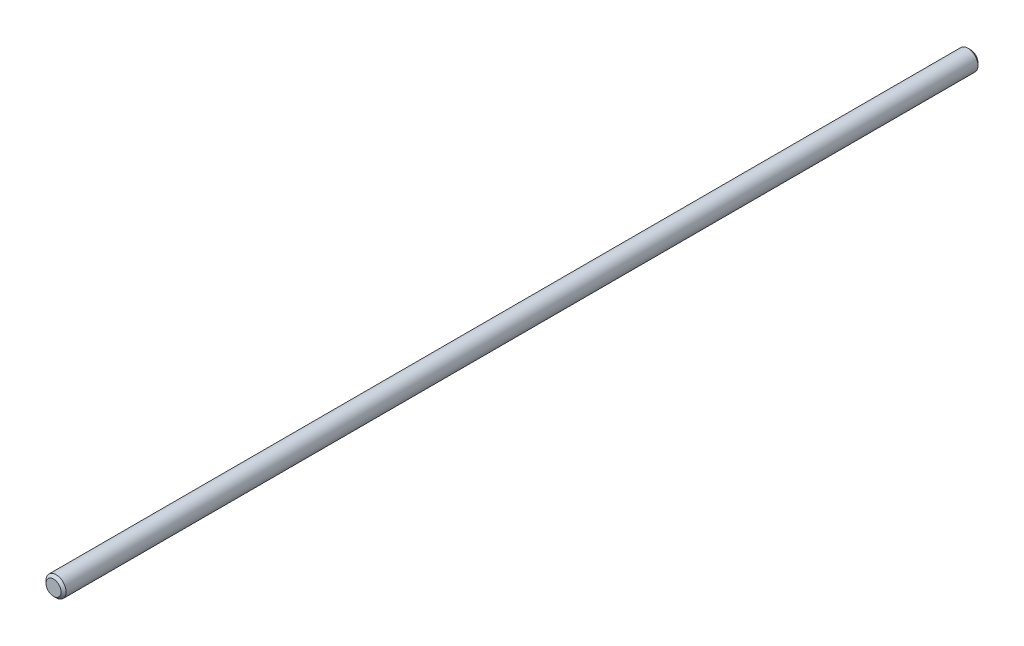
ISO-10303-21;
HEADER;
FILE_DESCRIPTION(('STEP AP214'),'2;1');
FILE_NAME('part.step','',(''),(''),'','','');
FILE_SCHEMA(('AUTOMOTIVE_DESIGN { 1 0 10303 214 1 1 1 1 }'));
ENDSEC;
DATA;
#1=APPLICATION_CONTEXT('core data for automotive mechanical design processes');
#2=APPLICATION_PROTOCOL_DEFINITION('international standard','automotive_design',2000,#1);
#3=PRODUCT_CONTEXT('',#1,'mechanical');
#4=PRODUCT('Part','Part','',(#3));
#5=PRODUCT_RELATED_PRODUCT_CATEGORY('part','',(#4));
#6=PRODUCT_DEFINITION_FORMATION('','',#4);
#7=PRODUCT_DEFINITION_CONTEXT('part definition',#1,'design');
#8=PRODUCT_DEFINITION('design','',#6,#7);
#9=PRODUCT_DEFINITION_SHAPE('','',#8);
#10=(LENGTH_UNIT() NAMED_UNIT(*) SI_UNIT(.MILLI.,.METRE.));
#11=(NAMED_UNIT(*) PLANE_ANGLE_UNIT() SI_UNIT($,.RADIAN.));
#12=(NAMED_UNIT(*) SI_UNIT($,.STERADIAN.) SOLID_ANGLE_UNIT());
#13=UNCERTAINTY_MEASURE_WITH_UNIT(LENGTH_MEASURE(1.E-05),#10,'distance_accuracy_value','');
#14=(GEOMETRIC_REPRESENTATION_CONTEXT(3) GLOBAL_UNCERTAINTY_ASSIGNED_CONTEXT((#13)) GLOBAL_UNIT_ASSIGNED_CONTEXT((#10,
#11,#12)) REPRESENTATION_CONTEXT('',''));
#15=CARTESIAN_POINT('',(0.,0.,0.));
#16=DIRECTION('',(0.,0.,1.));
#17=DIRECTION('',(1.,0.,0.));
#18=AXIS2_PLACEMENT_3D('',#15,#16,#17);
#19=CARTESIAN_POINT('',(0.,0.,365.));
#20=DIRECTION('',(0.,0.,-1.));
#21=DIRECTION('',(-1.,0.,0.));
#22=AXIS2_PLACEMENT_3D('',#19,#20,#21);
#23=CYLINDRICAL_SURFACE('',#22,4.);
#24=CARTESIAN_POINT('',(0.,0.,364.));
#25=DIRECTION('',(0.,0.,1.));
#26=DIRECTION('',(1.,0.,0.));
#27=AXIS2_PLACEMENT_3D('',#24,#25,#26);
#28=CIRCLE('',#27,4.);
#29=CARTESIAN_POINT('',(-4.,0.,364.));
#30=VERTEX_POINT('',#29);
#31=EDGE_CURVE('E40',#30,#30,#28,.F.);
#32=CARTESIAN_POINT('',(0.,0.,1.00000000000028));
#33=DIRECTION('',(0.,0.,1.));
#34=DIRECTION('',(1.,0.,0.));
#35=AXIS2_PLACEMENT_3D('',#32,#33,#34);
#36=CIRCLE('',#35,4.);
#37=CARTESIAN_POINT('',(-4.,0.,1.00000000000028));
#38=VERTEX_POINT('',#37);
#39=EDGE_CURVE('E44',#38,#38,#36,.T.);
#40=CARTESIAN_POINT('',(-4.,0.,364.));
#41=CARTESIAN_POINT('',(-4.,0.,360.21875));
#42=CARTESIAN_POINT('',(-4.,0.,356.4375));
#43=CARTESIAN_POINT('',(-4.,0.,348.875));
#44=CARTESIAN_POINT('',(-4.,0.,345.09375));
#45=CARTESIAN_POINT('',(-4.,0.,337.53125));
#46=CARTESIAN_POINT('',(-4.,0.,333.75));
#47=CARTESIAN_POINT('',(-4.,0.,326.1875));
#48=CARTESIAN_POINT('',(-4.,0.,322.40625));
#49=CARTESIAN_POINT('',(-4.,0.,314.84375));
#50=CARTESIAN_POINT('',(-4.,0.,311.0625));
#51=CARTESIAN_POINT('',(-4.,0.,303.5));
#52=CARTESIAN_POINT('',(-4.,0.,299.71875));
#53=CARTESIAN_POINT('',(-4.,0.,292.15625));
#54=CARTESIAN_POINT('',(-4.,0.,288.375));
#55=CARTESIAN_POINT('',(-4.,0.,280.8125));
#56=CARTESIAN_POINT('',(-4.,0.,277.03125));
#57=CARTESIAN_POINT('',(-4.,0.,269.46875));
#58=CARTESIAN_POINT('',(-4.,0.,265.6875));
#59=CARTESIAN_POINT('',(-4.,0.,258.125));
#60=CARTESIAN_POINT('',(-4.,0.,254.34375));
#61=CARTESIAN_POINT('',(-4.,0.,246.78125));
#62=CARTESIAN_POINT('',(-4.,0.,243.));
#63=CARTESIAN_POINT('',(-4.,0.,235.4375));
#64=CARTESIAN_POINT('',(-4.,0.,231.65625));
#65=CARTESIAN_POINT('',(-4.,0.,224.09375));
#66=CARTESIAN_POINT('',(-4.,0.,220.3125));
#67=CARTESIAN_POINT('',(-4.,0.,212.75));
#68=CARTESIAN_POINT('',(-4.,0.,208.96875));
#69=CARTESIAN_POINT('',(-4.,0.,201.40625));
#70=CARTESIAN_POINT('',(-4.,0.,197.625));
#71=CARTESIAN_POINT('',(-4.,0.,190.0625));
#72=CARTESIAN_POINT('',(-4.,0.,186.28125));
#73=CARTESIAN_POINT('',(-4.,0.,178.71875));
#74=CARTESIAN_POINT('',(-4.,0.,174.9375));
#75=CARTESIAN_POINT('',(-4.,0.,167.375));
#76=CARTESIAN_POINT('',(-4.,0.,163.59375));
#77=CARTESIAN_POINT('',(-4.,0.,156.03125));
#78=CARTESIAN_POINT('',(-4.,0.,152.25));
#79=CARTESIAN_POINT('',(-4.,0.,144.6875));
#80=CARTESIAN_POINT('',(-4.,0.,140.90625));
#81=CARTESIAN_POINT('',(-4.,0.,133.34375));
#82=CARTESIAN_POINT('',(-4.,0.,129.5625));
#83=CARTESIAN_POINT('',(-4.,0.,122.));
#84=CARTESIAN_POINT('',(-4.,0.,118.21875));
#85=CARTESIAN_POINT('',(-4.,0.,110.65625));
#86=CARTESIAN_POINT('',(-4.,0.,106.875));
#87=CARTESIAN_POINT('',(-4.,0.,99.3125000000003));
#88=CARTESIAN_POINT('',(-4.,0.,95.5312500000003));
#89=CARTESIAN_POINT('',(-4.,0.,87.9687500000003));
#90=CARTESIAN_POINT('',(-4.,0.,84.1875000000003));
#91=CARTESIAN_POINT('',(-4.,0.,76.6250000000003));
#92=CARTESIAN_POINT('',(-4.,0.,72.8437500000003));
#93=CARTESIAN_POINT('',(-4.,0.,65.2812500000003));
#94=CARTESIAN_POINT('',(-4.,0.,61.5000000000003));
#95=CARTESIAN_POINT('',(-4.,0.,53.9375000000003));
#96=CARTESIAN_POINT('',(-4.,0.,50.1562500000003));
#97=CARTESIAN_POINT('',(-4.,0.,42.5937500000003));
#98=CARTESIAN_POINT('',(-4.,0.,38.8125000000003));
#99=CARTESIAN_POINT('',(-4.,0.,31.2500000000003));
#100=CARTESIAN_POINT('',(-4.,0.,27.4687500000003));
#101=CARTESIAN_POINT('',(-4.,0.,19.9062500000003));
#102=CARTESIAN_POINT('',(-4.,0.,16.1250000000003));
#103=CARTESIAN_POINT('',(-4.,0.,8.56250000000027));
#104=CARTESIAN_POINT('',(-4.,0.,4.78125000000027));
#105=CARTESIAN_POINT('',(-4.,0.,1.00000000000028));
#106=B_SPLINE_CURVE_WITH_KNOTS('',3,(#40,#41,#42,#43,#44,#45,#46,#47,#48,#49,#50,#51,#52,#53,
#54,#55,#56,#57,#58,#59,#60,#61,#62,#63,#64,#65,#66,#67,#68,#69,#70,#71,#72,#73,#74,#75,#76,#77,
#78,#79,#80,#81,#82,#83,#84,#85,#86,#87,#88,#89,#90,#91,#92,#93,#94,#95,#96,#97,#98,#99,#100,
#101,#102,#103,#104,#105),.UNSPECIFIED.,.F.,.F.,(4,2,2,2,2,2,2,2,2,2,2,2,2,2,2,2,2,2,2,2,2,2,2,
2,2,2,2,2,2,2,2,2,4),(0.,11.34375,22.6875,34.03125,45.375,56.71875,68.0625,79.40625,90.75,
102.09375,113.4375,124.78125,136.125,147.46875,158.8125,170.15625,181.5,192.84375,204.1875,
215.53125,226.875,238.21875,249.5625,260.90625,272.25,283.59375,294.9375,306.28125,317.625,
328.96875,340.3125,351.65625,363.),.UNSPECIFIED.);
#107=EDGE_CURVE('BSEAM33',#30,#38,#106,.T.);
#108=ORIENTED_EDGE('',*,*,#31,.T.);
#109=ORIENTED_EDGE('',*,*,#39,.T.);
#110=ORIENTED_EDGE('',*,*,#107,.T.);
#111=ORIENTED_EDGE('',*,*,#107,.F.);
#112=EDGE_LOOP('',(#108,#110,#109,#111));
#113=FACE_BOUND('',#112,.T.);
#114=ADVANCED_FACE('F33',(#113),#23,.T.);
#115=CARTESIAN_POINT('',(0.,0.,365.));
#116=DIRECTION('',(0.,0.,1.));
#117=DIRECTION('',(1.,0.,0.));
#118=AXIS2_PLACEMENT_3D('',#115,#116,#117);
#119=PLANE('',#118);
#120=CARTESIAN_POINT('',(0.,0.,365.));
#121=DIRECTION('',(0.,0.,1.));
#122=DIRECTION('',(1.,0.,0.));
#123=AXIS2_PLACEMENT_3D('',#120,#121,#122);
#124=CIRCLE('',#123,3.00000000000017);
#125=CARTESIAN_POINT('',(3.00000000000017,0.,365.));
#126=VERTEX_POINT('',#125);
#127=EDGE_CURVE('E48',#126,#126,#124,.T.);
#128=ORIENTED_EDGE('',*,*,#127,.T.);
#129=EDGE_LOOP('',(#128));
#130=FACE_BOUND('',#129,.T.);
#131=ADVANCED_FACE('F54',(#130),#119,.T.);
#132=CARTESIAN_POINT('',(0.,0.,0.));
#133=DIRECTION('',(0.,0.,1.));
#134=DIRECTION('',(1.,0.,0.));
#135=AXIS2_PLACEMENT_3D('',#132,#133,#134);
#136=PLANE('',#135);
#137=CARTESIAN_POINT('',(0.,0.,0.));
#138=DIRECTION('',(0.,0.,1.));
#139=DIRECTION('',(1.,0.,0.));
#140=AXIS2_PLACEMENT_3D('',#137,#138,#139);
#141=CIRCLE('',#140,2.99999999999972);
#142=CARTESIAN_POINT('',(2.99999999999972,0.,0.));
#143=VERTEX_POINT('',#142);
#144=EDGE_CURVE('E10',#143,#143,#141,.F.);
#145=ORIENTED_EDGE('',*,*,#144,.T.);
#146=EDGE_LOOP('',(#145));
#147=FACE_BOUND('',#146,.T.);
#148=ADVANCED_FACE('F58',(#147),#136,.F.);
#149=CARTESIAN_POINT('',(0.,0.,365.));
#150=DIRECTION('',(0.,0.,-1.));
#151=DIRECTION('',(-1.,0.,0.));
#152=AXIS2_PLACEMENT_3D('',#149,#150,#151);
#153=CONICAL_SURFACE('',#152,3.00000000000017,0.785398163397447);
#154=ORIENTED_EDGE('',*,*,#31,.F.);
#155=EDGE_LOOP('',(#154));
#156=FACE_BOUND('',#155,.T.);
#157=ORIENTED_EDGE('',*,*,#127,.F.);
#158=EDGE_LOOP('',(#157));
#159=FACE_BOUND('',#158,.T.);
#160=ADVANCED_FACE('F56',(#156,#159),#153,.T.);
#161=CARTESIAN_POINT('',(0.,0.,1.00000000000028));
#162=DIRECTION('',(0.,0.,1.));
#163=DIRECTION('',(1.,0.,0.));
#164=AXIS2_PLACEMENT_3D('',#161,#162,#163);
#165=CONICAL_SURFACE('',#164,4.,0.785398163397447);
#166=ORIENTED_EDGE('',*,*,#144,.F.);
#167=EDGE_LOOP('',(#166));
#168=FACE_BOUND('',#167,.T.);
#169=ORIENTED_EDGE('',*,*,#39,.F.);
#170=EDGE_LOOP('',(#169));
#171=FACE_BOUND('',#170,.T.);
#172=ADVANCED_FACE('F35',(#168,#171),#165,.T.);
#173=CLOSED_SHELL('',(#114,#131,#148,#160,#172));
#174=MANIFOLD_SOLID_BREP('B2',#173);
#175=ADVANCED_BREP_SHAPE_REPRESENTATION('',(#18,#174),#14);
#176=SHAPE_DEFINITION_REPRESENTATION(#9,#175);
ENDSEC;
END-ISO-10303-21;
